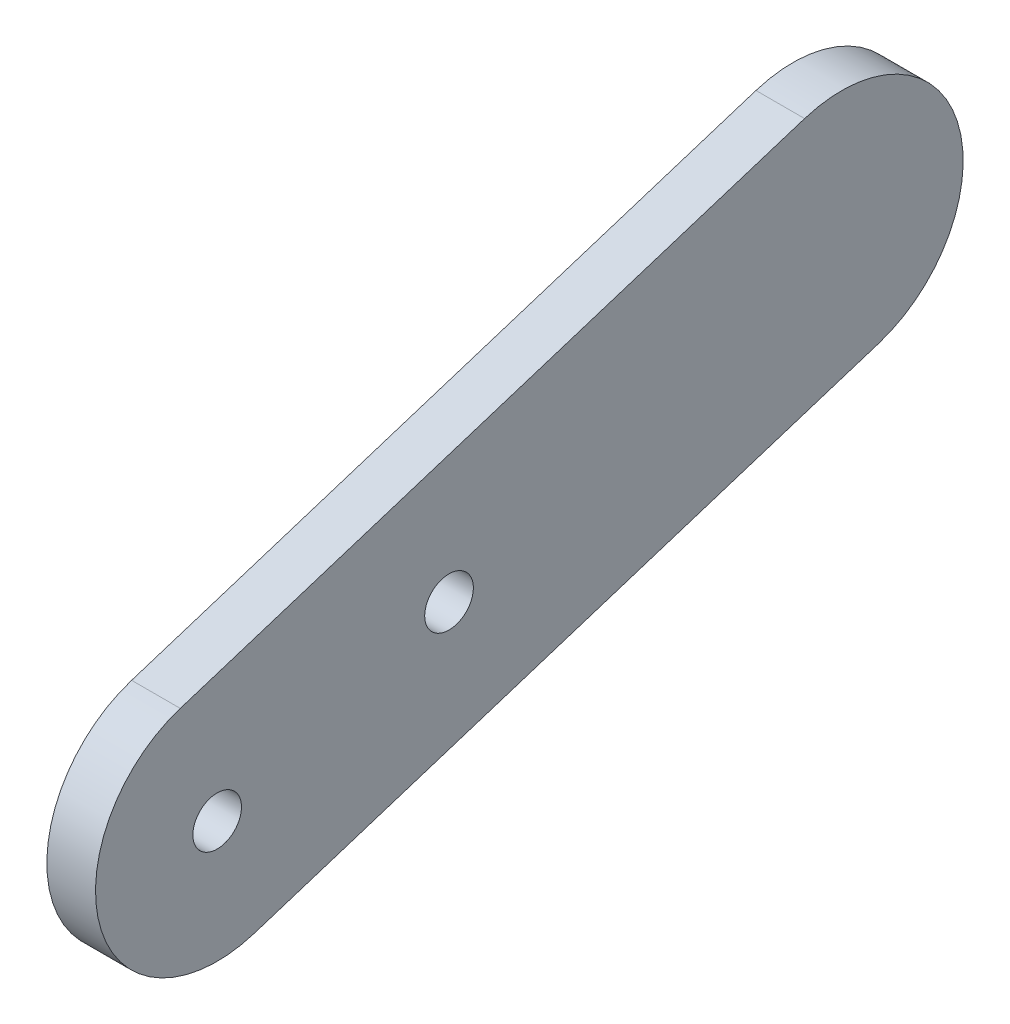
ISO-10303-21;
HEADER;
FILE_DESCRIPTION(('STEP AP214'),'2;1');
FILE_NAME('part.step','',(''),(''),'','','');
FILE_SCHEMA(('AUTOMOTIVE_DESIGN { 1 0 10303 214 1 1 1 1 }'));
ENDSEC;
DATA;
#1=APPLICATION_CONTEXT('core data for automotive mechanical design processes');
#2=APPLICATION_PROTOCOL_DEFINITION('international standard','automotive_design',2000,#1);
#3=PRODUCT_CONTEXT('',#1,'mechanical');
#4=PRODUCT('Part','Part','',(#3));
#5=PRODUCT_RELATED_PRODUCT_CATEGORY('part','',(#4));
#6=PRODUCT_DEFINITION_FORMATION('','',#4);
#7=PRODUCT_DEFINITION_CONTEXT('part definition',#1,'design');
#8=PRODUCT_DEFINITION('design','',#6,#7);
#9=PRODUCT_DEFINITION_SHAPE('','',#8);
#10=(LENGTH_UNIT() NAMED_UNIT(*) SI_UNIT(.MILLI.,.METRE.));
#11=(NAMED_UNIT(*) PLANE_ANGLE_UNIT() SI_UNIT($,.RADIAN.));
#12=(NAMED_UNIT(*) SI_UNIT($,.STERADIAN.) SOLID_ANGLE_UNIT());
#13=UNCERTAINTY_MEASURE_WITH_UNIT(LENGTH_MEASURE(1.E-05),#10,'distance_accuracy_value','');
#14=(GEOMETRIC_REPRESENTATION_CONTEXT(3) GLOBAL_UNCERTAINTY_ASSIGNED_CONTEXT((#13)) GLOBAL_UNIT_ASSIGNED_CONTEXT((#10,
#11,#12)) REPRESENTATION_CONTEXT('',''));
#15=CARTESIAN_POINT('',(0.,0.,0.));
#16=DIRECTION('',(0.,0.,1.));
#17=DIRECTION('',(1.,0.,0.));
#18=AXIS2_PLACEMENT_3D('',#15,#16,#17);
#19=CARTESIAN_POINT('',(-3.00000000000001,107.821179898714,95.0280606983583));
#20=DIRECTION('',(-1.,0.,0.));
#21=DIRECTION('',(0.,0.,1.));
#22=AXIS2_PLACEMENT_3D('',#19,#20,#21);
#23=PLANE('',#22);
#24=CARTESIAN_POINT('',(-3.00000000000001,112.369234757868,80.7341739981593));
#25=DIRECTION('',(-1.,0.,0.));
#26=DIRECTION('',(0.,0.,1.));
#27=AXIS2_PLACEMENT_3D('',#24,#25,#26);
#28=CIRCLE('',#27,1.4999999999999);
#29=CARTESIAN_POINT('',(-3.00000000000001,112.369234757868,82.2341739981592));
#30=VERTEX_POINT('',#29);
#31=EDGE_CURVE('E111',#30,#30,#28,.T.);
#32=ORIENTED_EDGE('',*,*,#31,.F.);
#33=EDGE_LOOP('',(#32));
#34=FACE_BOUND('',#33,.T.);
#35=CARTESIAN_POINT('',(-3.00000000000001,107.821179898714,95.0280606983583));
#36=DIRECTION('',(-1.,0.,0.));
#37=DIRECTION('',(0.,0.,1.));
#38=AXIS2_PLACEMENT_3D('',#35,#36,#37);
#39=CIRCLE('',#38,7.50000000000003);
#40=CARTESIAN_POINT('',(-3.00000000000001,100.674236548615,92.7540332687811));
#41=VERTEX_POINT('',#40);
#42=CARTESIAN_POINT('',(-3.00000000000001,114.968123248814,97.3020881279354));
#43=VERTEX_POINT('',#42);
#44=EDGE_CURVE('E90',#41,#43,#39,.T.);
#45=ORIENTED_EDGE('',*,*,#44,.T.);
#46=DIRECTION('',(0.,0.303203657276947,-0.952925780013262));
#47=VECTOR('',#46,1.);
#48=CARTESIAN_POINT('',(-3.00000000000001,114.968123248814,97.3020881279354));
#49=LINE('',#48,#47);
#50=CARTESIAN_POINT('',(-3.,127.215245053452,58.8111338847859));
#51=VERTEX_POINT('',#50);
#52=EDGE_CURVE('E85',#43,#51,#49,.T.);
#53=ORIENTED_EDGE('',*,*,#52,.T.);
#54=CARTESIAN_POINT('',(-3.,120.068301703353,56.5371064552088));
#55=DIRECTION('',(-1.,0.,0.));
#56=DIRECTION('',(0.,0.,1.));
#57=AXIS2_PLACEMENT_3D('',#54,#55,#56);
#58=CIRCLE('',#57,7.50000000000001);
#59=CARTESIAN_POINT('',(-3.,112.921358353253,54.2630790256317));
#60=VERTEX_POINT('',#59);
#61=EDGE_CURVE('E88',#51,#60,#58,.T.);
#62=ORIENTED_EDGE('',*,*,#61,.T.);
#63=DIRECTION('',(0.,-0.303203657276948,0.952925780013262));
#64=VECTOR('',#63,1.);
#65=CARTESIAN_POINT('',(-3.00000000000001,100.674236548615,92.7540332687811));
#66=LINE('',#65,#64);
#67=EDGE_CURVE('E55',#60,#41,#66,.T.);
#68=ORIENTED_EDGE('',*,*,#67,.T.);
#69=EDGE_LOOP('',(#45,#53,#62,#68));
#70=FACE_BOUND('',#69,.T.);
#71=CARTESIAN_POINT('',(-3.00000000000001,107.821179898714,95.0280606983583));
#72=DIRECTION('',(-1.,0.,0.));
#73=DIRECTION('',(0.,0.,1.));
#74=AXIS2_PLACEMENT_3D('',#71,#72,#73);
#75=CIRCLE('',#74,1.49999999999915);
#76=CARTESIAN_POINT('',(-3.00000000000001,107.821179898714,96.5280606983574));
#77=VERTEX_POINT('',#76);
#78=EDGE_CURVE('E136',#77,#77,#75,.T.);
#79=ORIENTED_EDGE('',*,*,#78,.F.);
#80=EDGE_LOOP('',(#79));
#81=FACE_BOUND('',#80,.T.);
#82=ADVANCED_FACE('F37',(#34,#70,#81),#23,.T.);
#83=CARTESIAN_POINT('',(0.,107.821179898714,95.0280606983583));
#84=DIRECTION('',(-1.,0.,0.));
#85=DIRECTION('',(0.,0.,1.));
#86=AXIS2_PLACEMENT_3D('',#83,#84,#85);
#87=PLANE('',#86);
#88=CARTESIAN_POINT('',(0.,107.821179898714,95.0280606983583));
#89=DIRECTION('',(-1.,0.,0.));
#90=DIRECTION('',(0.,0.,1.));
#91=AXIS2_PLACEMENT_3D('',#88,#89,#90);
#92=CIRCLE('',#91,7.50000000000003);
#93=CARTESIAN_POINT('',(0.,100.674236548615,92.7540332687811));
#94=VERTEX_POINT('',#93);
#95=CARTESIAN_POINT('',(0.,114.968123248814,97.3020881279354));
#96=VERTEX_POINT('',#95);
#97=EDGE_CURVE('E107',#94,#96,#92,.T.);
#98=ORIENTED_EDGE('',*,*,#97,.F.);
#99=DIRECTION('',(0.,-0.303203657276948,0.952925780013262));
#100=VECTOR('',#99,1.);
#101=CARTESIAN_POINT('',(0.,100.674236548615,92.7540332687811));
#102=LINE('',#101,#100);
#103=CARTESIAN_POINT('',(0.,112.921358353253,54.2630790256317));
#104=VERTEX_POINT('',#103);
#105=EDGE_CURVE('E78',#104,#94,#102,.T.);
#106=ORIENTED_EDGE('',*,*,#105,.F.);
#107=CARTESIAN_POINT('',(0.,120.068301703353,56.5371064552088));
#108=DIRECTION('',(-1.,0.,0.));
#109=DIRECTION('',(0.,0.,1.));
#110=AXIS2_PLACEMENT_3D('',#107,#108,#109);
#111=CIRCLE('',#110,7.50000000000001);
#112=CARTESIAN_POINT('',(0.,127.215245053452,58.8111338847859));
#113=VERTEX_POINT('',#112);
#114=EDGE_CURVE('E72',#113,#104,#111,.T.);
#115=ORIENTED_EDGE('',*,*,#114,.F.);
#116=DIRECTION('',(0.,0.303203657276947,-0.952925780013262));
#117=VECTOR('',#116,1.);
#118=CARTESIAN_POINT('',(0.,114.968123248814,97.3020881279354));
#119=LINE('',#118,#117);
#120=EDGE_CURVE('E95',#96,#113,#119,.T.);
#121=ORIENTED_EDGE('',*,*,#120,.F.);
#122=EDGE_LOOP('',(#98,#106,#115,#121));
#123=FACE_BOUND('',#122,.T.);
#124=CARTESIAN_POINT('',(0.,112.369234757868,80.7341739981593));
#125=DIRECTION('',(-1.,0.,0.));
#126=DIRECTION('',(0.,0.,1.));
#127=AXIS2_PLACEMENT_3D('',#124,#125,#126);
#128=CIRCLE('',#127,1.4999999999999);
#129=CARTESIAN_POINT('',(0.,112.369234757868,82.2341739981592));
#130=VERTEX_POINT('',#129);
#131=EDGE_CURVE('E132',#130,#130,#128,.T.);
#132=ORIENTED_EDGE('',*,*,#131,.T.);
#133=EDGE_LOOP('',(#132));
#134=FACE_BOUND('',#133,.T.);
#135=CARTESIAN_POINT('',(0.,107.821179898714,95.0280606983583));
#136=DIRECTION('',(-1.,0.,0.));
#137=DIRECTION('',(0.,0.,1.));
#138=AXIS2_PLACEMENT_3D('',#135,#136,#137);
#139=CIRCLE('',#138,1.49999999999915);
#140=CARTESIAN_POINT('',(0.,107.821179898714,96.5280606983574));
#141=VERTEX_POINT('',#140);
#142=EDGE_CURVE('E139',#141,#141,#139,.T.);
#143=ORIENTED_EDGE('',*,*,#142,.T.);
#144=EDGE_LOOP('',(#143));
#145=FACE_BOUND('',#144,.T.);
#146=ADVANCED_FACE('F125',(#123,#134,#145),#87,.F.);
#147=CARTESIAN_POINT('',(-3.00000000000001,107.821179898714,95.0280606983583));
#148=DIRECTION('',(1.,0.,0.));
#149=DIRECTION('',(0.,0.,-1.));
#150=AXIS2_PLACEMENT_3D('',#147,#148,#149);
#151=CYLINDRICAL_SURFACE('',#150,7.50000000000003);
#152=ORIENTED_EDGE('',*,*,#97,.T.);
#153=DIRECTION('',(1.,0.,0.));
#154=VECTOR('',#153,1.);
#155=CARTESIAN_POINT('',(-3.00000000000001,114.968123248814,97.3020881279354));
#156=LINE('',#155,#154);
#157=EDGE_CURVE('E11',#43,#96,#156,.T.);
#158=ORIENTED_EDGE('',*,*,#157,.F.);
#159=ORIENTED_EDGE('',*,*,#44,.F.);
#160=DIRECTION('',(1.,0.,0.));
#161=VECTOR('',#160,1.);
#162=CARTESIAN_POINT('',(-3.00000000000001,100.674236548615,92.7540332687811));
#163=LINE('',#162,#161);
#164=EDGE_CURVE('E103',#41,#94,#163,.T.);
#165=ORIENTED_EDGE('',*,*,#164,.T.);
#166=EDGE_LOOP('',(#152,#158,#159,#165));
#167=FACE_BOUND('',#166,.T.);
#168=ADVANCED_FACE('F39',(#167),#151,.T.);
#169=CARTESIAN_POINT('',(-3.00000000000001,114.968123248814,97.3020881279354));
#170=DIRECTION('',(0.,-0.952925780013262,-0.303203657276947));
#171=DIRECTION('',(0.,0.303203657276947,-0.952925780013262));
#172=AXIS2_PLACEMENT_3D('',#169,#170,#171);
#173=PLANE('',#172);
#174=ORIENTED_EDGE('',*,*,#120,.T.);
#175=DIRECTION('',(1.,0.,0.));
#176=VECTOR('',#175,1.);
#177=CARTESIAN_POINT('',(-3.,127.215245053452,58.8111338847859));
#178=LINE('',#177,#176);
#179=EDGE_CURVE('E47',#51,#113,#178,.T.);
#180=ORIENTED_EDGE('',*,*,#179,.F.);
#181=ORIENTED_EDGE('',*,*,#52,.F.);
#182=ORIENTED_EDGE('',*,*,#157,.T.);
#183=EDGE_LOOP('',(#174,#180,#181,#182));
#184=FACE_BOUND('',#183,.T.);
#185=ADVANCED_FACE('F94',(#184),#173,.F.);
#186=CARTESIAN_POINT('',(-3.,120.068301703353,56.5371064552088));
#187=DIRECTION('',(1.,0.,0.));
#188=DIRECTION('',(0.,0.,-1.));
#189=AXIS2_PLACEMENT_3D('',#186,#187,#188);
#190=CYLINDRICAL_SURFACE('',#189,7.50000000000001);
#191=ORIENTED_EDGE('',*,*,#114,.T.);
#192=DIRECTION('',(1.,0.,0.));
#193=VECTOR('',#192,1.);
#194=CARTESIAN_POINT('',(-3.,112.921358353253,54.2630790256317));
#195=LINE('',#194,#193);
#196=EDGE_CURVE('E97',#60,#104,#195,.T.);
#197=ORIENTED_EDGE('',*,*,#196,.F.);
#198=ORIENTED_EDGE('',*,*,#61,.F.);
#199=ORIENTED_EDGE('',*,*,#179,.T.);
#200=EDGE_LOOP('',(#191,#197,#198,#199));
#201=FACE_BOUND('',#200,.T.);
#202=ADVANCED_FACE('F98',(#201),#190,.T.);
#203=CARTESIAN_POINT('',(-3.00000000000001,100.674236548615,92.7540332687811));
#204=DIRECTION('',(0.,0.952925780013262,0.303203657276948));
#205=DIRECTION('',(0.,-0.303203657276948,0.952925780013262));
#206=AXIS2_PLACEMENT_3D('',#203,#204,#205);
#207=PLANE('',#206);
#208=ORIENTED_EDGE('',*,*,#105,.T.);
#209=ORIENTED_EDGE('',*,*,#164,.F.);
#210=ORIENTED_EDGE('',*,*,#67,.F.);
#211=ORIENTED_EDGE('',*,*,#196,.T.);
#212=EDGE_LOOP('',(#208,#209,#210,#211));
#213=FACE_BOUND('',#212,.T.);
#214=ADVANCED_FACE('F122',(#213),#207,.F.);
#215=CARTESIAN_POINT('',(-3.00000000000001,112.369234757868,80.7341739981593));
#216=DIRECTION('',(1.,0.,0.));
#217=DIRECTION('',(0.,0.,-1.));
#218=AXIS2_PLACEMENT_3D('',#215,#216,#217);
#219=CYLINDRICAL_SURFACE('',#218,1.4999999999999);
#220=ORIENTED_EDGE('',*,*,#31,.T.);
#221=EDGE_LOOP('',(#220));
#222=FACE_BOUND('',#221,.T.);
#223=ORIENTED_EDGE('',*,*,#131,.F.);
#224=EDGE_LOOP('',(#223));
#225=FACE_BOUND('',#224,.T.);
#226=ADVANCED_FACE('F159',(#222,#225),#219,.F.);
#227=CARTESIAN_POINT('',(-3.00000000000001,107.821179898714,95.0280606983583));
#228=DIRECTION('',(1.,0.,0.));
#229=DIRECTION('',(0.,0.,-1.));
#230=AXIS2_PLACEMENT_3D('',#227,#228,#229);
#231=CYLINDRICAL_SURFACE('',#230,1.49999999999915);
#232=ORIENTED_EDGE('',*,*,#78,.T.);
#233=EDGE_LOOP('',(#232));
#234=FACE_BOUND('',#233,.T.);
#235=ORIENTED_EDGE('',*,*,#142,.F.);
#236=EDGE_LOOP('',(#235));
#237=FACE_BOUND('',#236,.T.);
#238=ADVANCED_FACE('F148',(#234,#237),#231,.F.);
#239=CLOSED_SHELL('',(#82,#146,#168,#185,#202,#214,#226,#238));
#240=MANIFOLD_SOLID_BREP('B2',#239);
#241=ADVANCED_BREP_SHAPE_REPRESENTATION('',(#18,#240),#14);
#242=SHAPE_DEFINITION_REPRESENTATION(#9,#241);
ENDSEC;
END-ISO-10303-21;
